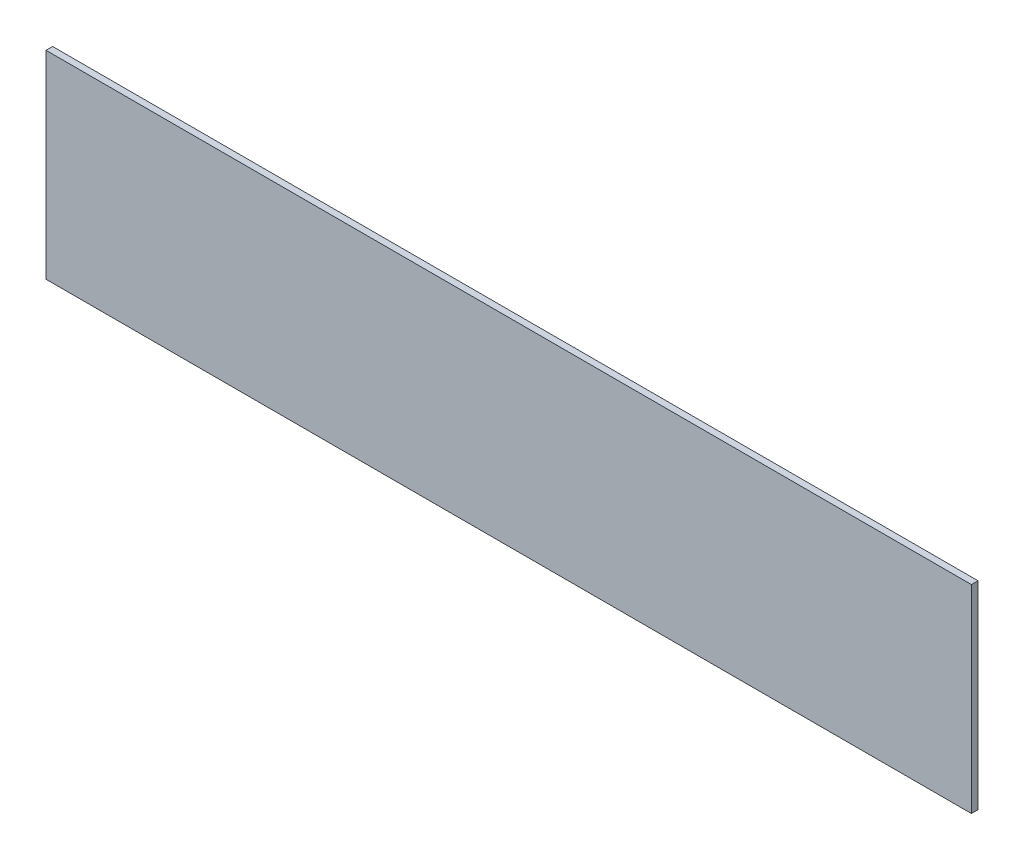
ISO-10303-21;
HEADER;
FILE_DESCRIPTION(('STEP AP214'),'2;1');
FILE_NAME('part.step','',(''),(''),'','','');
FILE_SCHEMA(('AUTOMOTIVE_DESIGN { 1 0 10303 214 1 1 1 1 }'));
ENDSEC;
DATA;
#1=APPLICATION_CONTEXT('core data for automotive mechanical design processes');
#2=APPLICATION_PROTOCOL_DEFINITION('international standard','automotive_design',2000,#1);
#3=PRODUCT_CONTEXT('',#1,'mechanical');
#4=PRODUCT('Part','Part','',(#3));
#5=PRODUCT_RELATED_PRODUCT_CATEGORY('part','',(#4));
#6=PRODUCT_DEFINITION_FORMATION('','',#4);
#7=PRODUCT_DEFINITION_CONTEXT('part definition',#1,'design');
#8=PRODUCT_DEFINITION('design','',#6,#7);
#9=PRODUCT_DEFINITION_SHAPE('','',#8);
#10=(LENGTH_UNIT() NAMED_UNIT(*) SI_UNIT(.MILLI.,.METRE.));
#11=(NAMED_UNIT(*) PLANE_ANGLE_UNIT() SI_UNIT($,.RADIAN.));
#12=(NAMED_UNIT(*) SI_UNIT($,.STERADIAN.) SOLID_ANGLE_UNIT());
#13=UNCERTAINTY_MEASURE_WITH_UNIT(LENGTH_MEASURE(1.E-05),#10,'distance_accuracy_value','');
#14=(GEOMETRIC_REPRESENTATION_CONTEXT(3) GLOBAL_UNCERTAINTY_ASSIGNED_CONTEXT((#13)) GLOBAL_UNIT_ASSIGNED_CONTEXT((#10,
#11,#12)) REPRESENTATION_CONTEXT('',''));
#15=CARTESIAN_POINT('',(0.,0.,0.));
#16=DIRECTION('',(0.,0.,1.));
#17=DIRECTION('',(1.,0.,0.));
#18=AXIS2_PLACEMENT_3D('',#15,#16,#17);
#19=CARTESIAN_POINT('',(-167.703180212014,80.3886925795053,2.));
#20=DIRECTION('',(1.,0.,0.));
#21=DIRECTION('',(0.,0.,-1.));
#22=AXIS2_PLACEMENT_3D('',#19,#20,#21);
#23=PLANE('',#22);
#24=DIRECTION('',(0.,-1.,0.));
#25=VECTOR('',#24,1.);
#26=CARTESIAN_POINT('',(-167.703180212014,80.3886925795053,0.));
#27=LINE('',#26,#25);
#28=CARTESIAN_POINT('',(-167.703180212014,80.3886925795053,0.));
#29=VERTEX_POINT('',#28);
#30=CARTESIAN_POINT('',(-167.703180212014,20.3886925795053,0.));
#31=VERTEX_POINT('',#30);
#32=EDGE_CURVE('E96',#29,#31,#27,.T.);
#33=ORIENTED_EDGE('',*,*,#32,.T.);
#34=DIRECTION('',(0.,0.,-1.));
#35=VECTOR('',#34,1.);
#36=CARTESIAN_POINT('',(-167.703180212014,20.3886925795053,2.));
#37=LINE('',#36,#35);
#38=CARTESIAN_POINT('',(-167.703180212014,20.3886925795053,2.));
#39=VERTEX_POINT('',#38);
#40=EDGE_CURVE('E11',#39,#31,#37,.T.);
#41=ORIENTED_EDGE('',*,*,#40,.F.);
#42=DIRECTION('',(0.,-1.,0.));
#43=VECTOR('',#42,1.);
#44=CARTESIAN_POINT('',(-167.703180212014,80.3886925795053,2.));
#45=LINE('',#44,#43);
#46=CARTESIAN_POINT('',(-167.703180212014,80.3886925795053,2.));
#47=VERTEX_POINT('',#46);
#48=EDGE_CURVE('E84',#47,#39,#45,.T.);
#49=ORIENTED_EDGE('',*,*,#48,.F.);
#50=DIRECTION('',(0.,0.,-1.));
#51=VECTOR('',#50,1.);
#52=CARTESIAN_POINT('',(-167.703180212014,80.3886925795053,2.));
#53=LINE('',#52,#51);
#54=EDGE_CURVE('E92',#47,#29,#53,.T.);
#55=ORIENTED_EDGE('',*,*,#54,.T.);
#56=EDGE_LOOP('',(#33,#41,#49,#55));
#57=FACE_BOUND('',#56,.T.);
#58=ADVANCED_FACE('F33',(#57),#23,.F.);
#59=CARTESIAN_POINT('',(-167.703180212014,20.3886925795053,2.));
#60=DIRECTION('',(0.,1.,0.));
#61=DIRECTION('',(0.,0.,1.));
#62=AXIS2_PLACEMENT_3D('',#59,#60,#61);
#63=PLANE('',#62);
#64=DIRECTION('',(1.,0.,0.));
#65=VECTOR('',#64,1.);
#66=CARTESIAN_POINT('',(-167.703180212014,20.3886925795053,0.));
#67=LINE('',#66,#65);
#68=CARTESIAN_POINT('',(112.296819787986,20.3886925795053,0.));
#69=VERTEX_POINT('',#68);
#70=EDGE_CURVE('E88',#31,#69,#67,.T.);
#71=ORIENTED_EDGE('',*,*,#70,.T.);
#72=DIRECTION('',(0.,0.,-1.));
#73=VECTOR('',#72,1.);
#74=CARTESIAN_POINT('',(112.296819787986,20.3886925795053,2.));
#75=LINE('',#74,#73);
#76=CARTESIAN_POINT('',(112.296819787986,20.3886925795053,2.));
#77=VERTEX_POINT('',#76);
#78=EDGE_CURVE('E41',#77,#69,#75,.T.);
#79=ORIENTED_EDGE('',*,*,#78,.F.);
#80=DIRECTION('',(1.,0.,0.));
#81=VECTOR('',#80,1.);
#82=CARTESIAN_POINT('',(-167.703180212014,20.3886925795053,2.));
#83=LINE('',#82,#81);
#84=EDGE_CURVE('E79',#39,#77,#83,.T.);
#85=ORIENTED_EDGE('',*,*,#84,.F.);
#86=ORIENTED_EDGE('',*,*,#40,.T.);
#87=EDGE_LOOP('',(#71,#79,#85,#86));
#88=FACE_BOUND('',#87,.T.);
#89=ADVANCED_FACE('F87',(#88),#63,.F.);
#90=CARTESIAN_POINT('',(112.296819787986,80.3886925795053,2.));
#91=DIRECTION('',(-1.,0.,0.));
#92=DIRECTION('',(0.,-1.,0.));
#93=AXIS2_PLACEMENT_3D('',#90,#91,#92);
#94=PLANE('',#93);
#95=DIRECTION('',(0.,1.,0.));
#96=VECTOR('',#95,1.);
#97=CARTESIAN_POINT('',(112.296819787986,80.3886925795053,0.));
#98=LINE('',#97,#96);
#99=CARTESIAN_POINT('',(112.296819787986,80.3886925795053,0.));
#100=VERTEX_POINT('',#99);
#101=EDGE_CURVE('E66',#69,#100,#98,.T.);
#102=ORIENTED_EDGE('',*,*,#101,.T.);
#103=DIRECTION('',(0.,0.,-1.));
#104=VECTOR('',#103,1.);
#105=CARTESIAN_POINT('',(112.296819787986,80.3886925795053,2.));
#106=LINE('',#105,#104);
#107=CARTESIAN_POINT('',(112.296819787986,80.3886925795053,2.));
#108=VERTEX_POINT('',#107);
#109=EDGE_CURVE('E89',#108,#100,#106,.T.);
#110=ORIENTED_EDGE('',*,*,#109,.F.);
#111=DIRECTION('',(0.,1.,0.));
#112=VECTOR('',#111,1.);
#113=CARTESIAN_POINT('',(112.296819787986,80.3886925795053,2.));
#114=LINE('',#113,#112);
#115=EDGE_CURVE('E82',#77,#108,#114,.T.);
#116=ORIENTED_EDGE('',*,*,#115,.F.);
#117=ORIENTED_EDGE('',*,*,#78,.T.);
#118=EDGE_LOOP('',(#102,#110,#116,#117));
#119=FACE_BOUND('',#118,.T.);
#120=ADVANCED_FACE('F90',(#119),#94,.F.);
#121=CARTESIAN_POINT('',(-167.703180212014,80.3886925795053,2.));
#122=DIRECTION('',(0.,-1.,0.));
#123=DIRECTION('',(0.,0.,-1.));
#124=AXIS2_PLACEMENT_3D('',#121,#122,#123);
#125=PLANE('',#124);
#126=DIRECTION('',(-1.,0.,0.));
#127=VECTOR('',#126,1.);
#128=CARTESIAN_POINT('',(-167.703180212014,80.3886925795053,0.));
#129=LINE('',#128,#127);
#130=EDGE_CURVE('E72',#100,#29,#129,.T.);
#131=ORIENTED_EDGE('',*,*,#130,.T.);
#132=ORIENTED_EDGE('',*,*,#54,.F.);
#133=DIRECTION('',(-1.,0.,0.));
#134=VECTOR('',#133,1.);
#135=CARTESIAN_POINT('',(-167.703180212014,80.3886925795053,2.));
#136=LINE('',#135,#134);
#137=EDGE_CURVE('E49',#108,#47,#136,.T.);
#138=ORIENTED_EDGE('',*,*,#137,.F.);
#139=ORIENTED_EDGE('',*,*,#109,.T.);
#140=EDGE_LOOP('',(#131,#132,#138,#139));
#141=FACE_BOUND('',#140,.T.);
#142=ADVANCED_FACE('F103',(#141),#125,.F.);
#143=CARTESIAN_POINT('',(0.,0.,2.));
#144=DIRECTION('',(0.,0.,1.));
#145=DIRECTION('',(1.,0.,0.));
#146=AXIS2_PLACEMENT_3D('',#143,#144,#145);
#147=PLANE('',#146);
#148=ORIENTED_EDGE('',*,*,#48,.T.);
#149=ORIENTED_EDGE('',*,*,#84,.T.);
#150=ORIENTED_EDGE('',*,*,#115,.T.);
#151=ORIENTED_EDGE('',*,*,#137,.T.);
#152=EDGE_LOOP('',(#148,#149,#150,#151));
#153=FACE_BOUND('',#152,.T.);
#154=ADVANCED_FACE('F80',(#153),#147,.T.);
#155=CARTESIAN_POINT('',(0.,0.,0.));
#156=DIRECTION('',(0.,0.,1.));
#157=DIRECTION('',(1.,0.,0.));
#158=AXIS2_PLACEMENT_3D('',#155,#156,#157);
#159=PLANE('',#158);
#160=ORIENTED_EDGE('',*,*,#32,.F.);
#161=ORIENTED_EDGE('',*,*,#130,.F.);
#162=ORIENTED_EDGE('',*,*,#101,.F.);
#163=ORIENTED_EDGE('',*,*,#70,.F.);
#164=EDGE_LOOP('',(#160,#161,#162,#163));
#165=FACE_BOUND('',#164,.T.);
#166=ADVANCED_FACE('F106',(#165),#159,.F.);
#167=CLOSED_SHELL('',(#58,#89,#120,#142,#154,#166));
#168=MANIFOLD_SOLID_BREP('B2',#167);
#169=ADVANCED_BREP_SHAPE_REPRESENTATION('',(#18,#168),#14);
#170=SHAPE_DEFINITION_REPRESENTATION(#9,#169);
ENDSEC;
END-ISO-10303-21;
